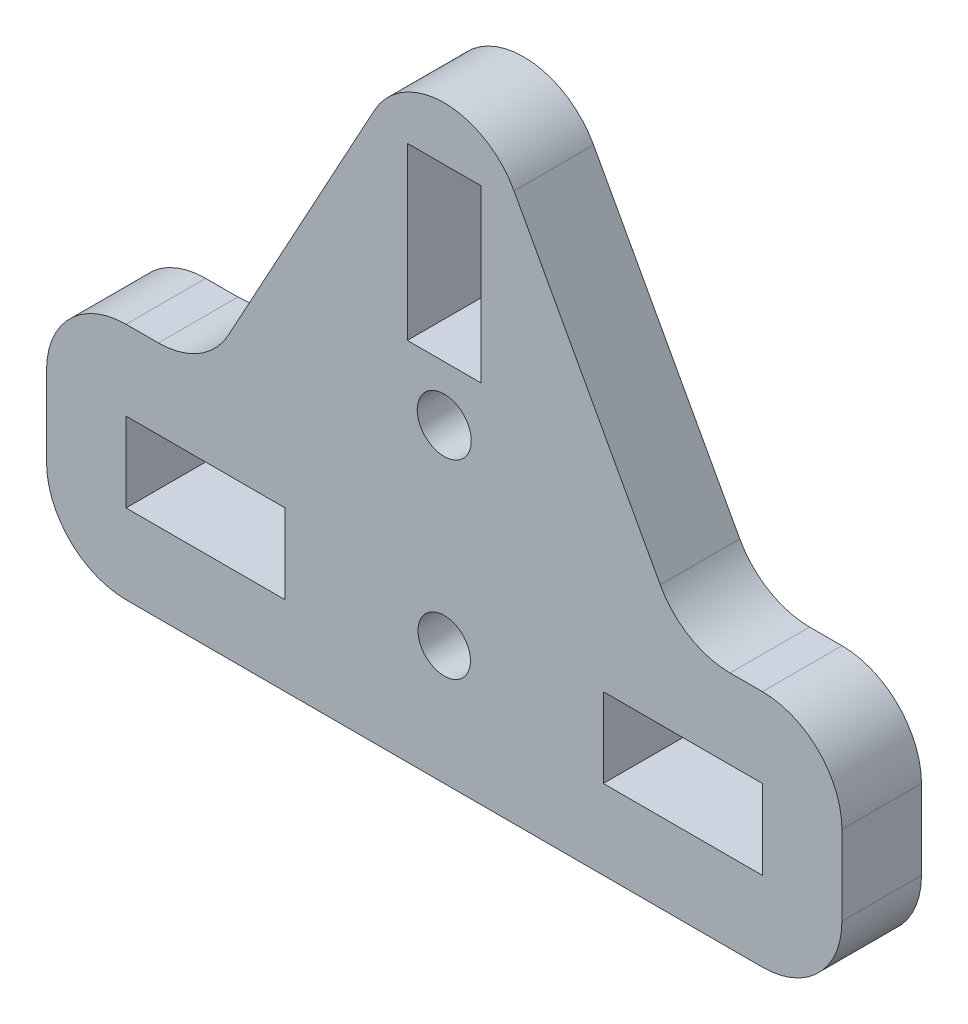
ISO-10303-21;
HEADER;
FILE_DESCRIPTION(('STEP AP214'),'2;1');
FILE_NAME('part.step','',(''),(''),'','','');
FILE_SCHEMA(('AUTOMOTIVE_DESIGN { 1 0 10303 214 1 1 1 1 }'));
ENDSEC;
DATA;
#1=APPLICATION_CONTEXT('core data for automotive mechanical design processes');
#2=APPLICATION_PROTOCOL_DEFINITION('international standard','automotive_design',2000,#1);
#3=PRODUCT_CONTEXT('',#1,'mechanical');
#4=PRODUCT('Part','Part','',(#3));
#5=PRODUCT_RELATED_PRODUCT_CATEGORY('part','',(#4));
#6=PRODUCT_DEFINITION_FORMATION('','',#4);
#7=PRODUCT_DEFINITION_CONTEXT('part definition',#1,'design');
#8=PRODUCT_DEFINITION('design','',#6,#7);
#9=PRODUCT_DEFINITION_SHAPE('','',#8);
#10=(LENGTH_UNIT() NAMED_UNIT(*) SI_UNIT(.MILLI.,.METRE.));
#11=(NAMED_UNIT(*) PLANE_ANGLE_UNIT() SI_UNIT($,.RADIAN.));
#12=(NAMED_UNIT(*) SI_UNIT($,.STERADIAN.) SOLID_ANGLE_UNIT());
#13=UNCERTAINTY_MEASURE_WITH_UNIT(LENGTH_MEASURE(1.E-05),#10,'distance_accuracy_value','');
#14=(GEOMETRIC_REPRESENTATION_CONTEXT(3) GLOBAL_UNCERTAINTY_ASSIGNED_CONTEXT((#13)) GLOBAL_UNIT_ASSIGNED_CONTEXT((#10,
#11,#12)) REPRESENTATION_CONTEXT('',''));
#15=CARTESIAN_POINT('',(0.,0.,0.));
#16=DIRECTION('',(0.,0.,1.));
#17=DIRECTION('',(1.,0.,0.));
#18=AXIS2_PLACEMENT_3D('',#15,#16,#17);
#19=CARTESIAN_POINT('',(-31.75,9.525,6.35));
#20=DIRECTION('',(0.,-1.,0.));
#21=DIRECTION('',(0.,0.,-1.));
#22=AXIS2_PLACEMENT_3D('',#19,#20,#21);
#23=PLANE('',#22);
#24=DIRECTION('',(-1.,0.,0.));
#25=VECTOR('',#24,1.);
#26=CARTESIAN_POINT('',(-31.75,9.525,0.));
#27=LINE('',#26,#25);
#28=CARTESIAN_POINT('',(-22.819570177,9.525,0.));
#29=VERTEX_POINT('',#28);
#30=CARTESIAN_POINT('',(-25.4,9.525,0.));
#31=VERTEX_POINT('',#30);
#32=EDGE_CURVE('E375',#29,#31,#27,.T.);
#33=ORIENTED_EDGE('',*,*,#32,.T.);
#34=DIRECTION('',(0.,0.,-1.));
#35=VECTOR('',#34,1.);
#36=CARTESIAN_POINT('',(-25.4,9.525,6.35));
#37=LINE('',#36,#35);
#38=CARTESIAN_POINT('',(-25.4,9.525,6.35));
#39=VERTEX_POINT('',#38);
#40=EDGE_CURVE('E425',#31,#39,#37,.F.);
#41=ORIENTED_EDGE('',*,*,#40,.T.);
#42=DIRECTION('',(-1.,0.,0.));
#43=VECTOR('',#42,1.);
#44=CARTESIAN_POINT('',(-31.75,9.525,6.35));
#45=LINE('',#44,#43);
#46=CARTESIAN_POINT('',(-22.819570177,9.525,6.35));
#47=VERTEX_POINT('',#46);
#48=EDGE_CURVE('E346',#47,#39,#45,.T.);
#49=ORIENTED_EDGE('',*,*,#48,.F.);
#50=DIRECTION('',(0.,0.,1.));
#51=VECTOR('',#50,1.);
#52=CARTESIAN_POINT('',(-22.819570177,9.525,0.));
#53=LINE('',#52,#51);
#54=EDGE_CURVE('E423',#47,#29,#53,.F.);
#55=ORIENTED_EDGE('',*,*,#54,.T.);
#56=EDGE_LOOP('',(#33,#41,#49,#55));
#57=FACE_BOUND('',#56,.T.);
#58=ADVANCED_FACE('F34',(#57),#23,.F.);
#59=CARTESIAN_POINT('',(31.75,-9.525,6.35));
#60=DIRECTION('',(-1.,0.,0.));
#61=DIRECTION('',(0.,0.,1.));
#62=AXIS2_PLACEMENT_3D('',#59,#60,#61);
#63=PLANE('',#62);
#64=DIRECTION('',(0.,1.,0.));
#65=VECTOR('',#64,1.);
#66=CARTESIAN_POINT('',(31.75,-9.525,6.35));
#67=LINE('',#66,#65);
#68=CARTESIAN_POINT('',(31.75,-3.175,6.35));
#69=VERTEX_POINT('',#68);
#70=CARTESIAN_POINT('',(31.75,3.175,6.35));
#71=VERTEX_POINT('',#70);
#72=EDGE_CURVE('E343',#69,#71,#67,.T.);
#73=ORIENTED_EDGE('',*,*,#72,.F.);
#74=DIRECTION('',(0.,0.,-1.));
#75=VECTOR('',#74,1.);
#76=CARTESIAN_POINT('',(31.75,-3.175,6.35));
#77=LINE('',#76,#75);
#78=CARTESIAN_POINT('',(31.75,-3.175,0.));
#79=VERTEX_POINT('',#78);
#80=EDGE_CURVE('E370',#69,#79,#77,.T.);
#81=ORIENTED_EDGE('',*,*,#80,.T.);
#82=DIRECTION('',(0.,1.,0.));
#83=VECTOR('',#82,1.);
#84=CARTESIAN_POINT('',(31.75,-9.525,0.));
#85=LINE('',#84,#83);
#86=CARTESIAN_POINT('',(31.75,3.175,0.));
#87=VERTEX_POINT('',#86);
#88=EDGE_CURVE('E340',#79,#87,#85,.T.);
#89=ORIENTED_EDGE('',*,*,#88,.T.);
#90=DIRECTION('',(0.,0.,-1.));
#91=VECTOR('',#90,1.);
#92=CARTESIAN_POINT('',(31.75,3.175,6.35));
#93=LINE('',#92,#91);
#94=EDGE_CURVE('E368',#87,#71,#93,.F.);
#95=ORIENTED_EDGE('',*,*,#94,.T.);
#96=EDGE_LOOP('',(#73,#81,#89,#95));
#97=FACE_BOUND('',#96,.T.);
#98=ADVANCED_FACE('F476',(#97),#63,.F.);
#99=CARTESIAN_POINT('',(25.4,9.525,6.35));
#100=VERTEX_POINT('',#99);
#101=CARTESIAN_POINT('',(22.819570177,9.525,6.35));
#102=VERTEX_POINT('',#101);
#103=EDGE_CURVE('E357',#100,#102,#45,.T.);
#104=ORIENTED_EDGE('',*,*,#103,.F.);
#105=DIRECTION('',(0.,0.,-1.));
#106=VECTOR('',#105,1.);
#107=CARTESIAN_POINT('',(25.4,9.525,6.35));
#108=LINE('',#107,#106);
#109=CARTESIAN_POINT('',(25.4,9.525,0.));
#110=VERTEX_POINT('',#109);
#111=EDGE_CURVE('E414',#100,#110,#108,.T.);
#112=ORIENTED_EDGE('',*,*,#111,.T.);
#113=CARTESIAN_POINT('',(22.819570177,9.525,0.));
#114=VERTEX_POINT('',#113);
#115=EDGE_CURVE('E379',#110,#114,#27,.T.);
#116=ORIENTED_EDGE('',*,*,#115,.T.);
#117=DIRECTION('',(0.,0.,1.));
#118=VECTOR('',#117,1.);
#119=CARTESIAN_POINT('',(22.819570177,9.525,6.35));
#120=LINE('',#119,#118);
#121=EDGE_CURVE('E411',#114,#102,#120,.T.);
#122=ORIENTED_EDGE('',*,*,#121,.T.);
#123=EDGE_LOOP('',(#104,#112,#116,#122));
#124=FACE_BOUND('',#123,.T.);
#125=ADVANCED_FACE('F465',(#124),#23,.F.);
#126=CARTESIAN_POINT('',(-31.75,-9.525,6.35));
#127=DIRECTION('',(1.,0.,0.));
#128=DIRECTION('',(0.,0.,-1.));
#129=AXIS2_PLACEMENT_3D('',#126,#127,#128);
#130=PLANE('',#129);
#131=DIRECTION('',(0.,-1.,0.));
#132=VECTOR('',#131,1.);
#133=CARTESIAN_POINT('',(-31.75,-9.525,0.));
#134=LINE('',#133,#132);
#135=CARTESIAN_POINT('',(-31.75,3.175,0.));
#136=VERTEX_POINT('',#135);
#137=CARTESIAN_POINT('',(-31.75,-3.175,0.));
#138=VERTEX_POINT('',#137);
#139=EDGE_CURVE('E384',#136,#138,#134,.T.);
#140=ORIENTED_EDGE('',*,*,#139,.T.);
#141=DIRECTION('',(0.,0.,-1.));
#142=VECTOR('',#141,1.);
#143=CARTESIAN_POINT('',(-31.75,-3.175,6.35));
#144=LINE('',#143,#142);
#145=CARTESIAN_POINT('',(-31.75,-3.175,6.35));
#146=VERTEX_POINT('',#145);
#147=EDGE_CURVE('E49',#138,#146,#144,.F.);
#148=ORIENTED_EDGE('',*,*,#147,.T.);
#149=DIRECTION('',(0.,-1.,0.));
#150=VECTOR('',#149,1.);
#151=CARTESIAN_POINT('',(-31.75,-9.525,6.35));
#152=LINE('',#151,#150);
#153=CARTESIAN_POINT('',(-31.75,3.175,6.35));
#154=VERTEX_POINT('',#153);
#155=EDGE_CURVE('E350',#154,#146,#152,.T.);
#156=ORIENTED_EDGE('',*,*,#155,.F.);
#157=DIRECTION('',(0.,0.,-1.));
#158=VECTOR('',#157,1.);
#159=CARTESIAN_POINT('',(-31.75,3.175,6.35));
#160=LINE('',#159,#158);
#161=EDGE_CURVE('E419',#154,#136,#160,.T.);
#162=ORIENTED_EDGE('',*,*,#161,.T.);
#163=EDGE_LOOP('',(#140,#148,#156,#162));
#164=FACE_BOUND('',#163,.T.);
#165=ADVANCED_FACE('F508',(#164),#130,.F.);
#166=CARTESIAN_POINT('',(-31.75,-9.525,6.35));
#167=DIRECTION('',(0.,1.,0.));
#168=DIRECTION('',(0.,0.,1.));
#169=AXIS2_PLACEMENT_3D('',#166,#167,#168);
#170=PLANE('',#169);
#171=DIRECTION('',(1.,0.,0.));
#172=VECTOR('',#171,1.);
#173=CARTESIAN_POINT('',(-31.75,-9.525,0.));
#174=LINE('',#173,#172);
#175=CARTESIAN_POINT('',(-25.4,-9.525,0.));
#176=VERTEX_POINT('',#175);
#177=CARTESIAN_POINT('',(25.4,-9.525,0.));
#178=VERTEX_POINT('',#177);
#179=EDGE_CURVE('E347',#176,#178,#174,.T.);
#180=ORIENTED_EDGE('',*,*,#179,.T.);
#181=DIRECTION('',(0.,0.,-1.));
#182=VECTOR('',#181,1.);
#183=CARTESIAN_POINT('',(25.4,-9.525,6.35));
#184=LINE('',#183,#182);
#185=CARTESIAN_POINT('',(25.4,-9.525,6.35));
#186=VERTEX_POINT('',#185);
#187=EDGE_CURVE('E360',#178,#186,#184,.F.);
#188=ORIENTED_EDGE('',*,*,#187,.T.);
#189=DIRECTION('',(1.,0.,0.));
#190=VECTOR('',#189,1.);
#191=CARTESIAN_POINT('',(-31.75,-9.525,6.35));
#192=LINE('',#191,#190);
#193=CARTESIAN_POINT('',(-25.4,-9.525,6.35));
#194=VERTEX_POINT('',#193);
#195=EDGE_CURVE('E371',#194,#186,#192,.T.);
#196=ORIENTED_EDGE('',*,*,#195,.F.);
#197=DIRECTION('',(0.,0.,-1.));
#198=VECTOR('',#197,1.);
#199=CARTESIAN_POINT('',(-25.4,-9.525,6.35));
#200=LINE('',#199,#198);
#201=EDGE_CURVE('E395',#194,#176,#200,.T.);
#202=ORIENTED_EDGE('',*,*,#201,.T.);
#203=EDGE_LOOP('',(#180,#188,#196,#202));
#204=FACE_BOUND('',#203,.T.);
#205=ADVANCED_FACE('F481',(#204),#170,.F.);
#206=CARTESIAN_POINT('',(0.,0.,6.35));
#207=DIRECTION('',(0.,0.,-1.));
#208=DIRECTION('',(-1.,0.,0.));
#209=AXIS2_PLACEMENT_3D('',#206,#207,#208);
#210=PLANE('',#209);
#211=DIRECTION('',(1.,0.,0.));
#212=VECTOR('',#211,1.);
#213=CARTESIAN_POINT('',(-2.94640000000003,33.2635268836412,6.35));
#214=LINE('',#213,#212);
#215=CARTESIAN_POINT('',(-2.94640000000003,33.2635268836412,6.35));
#216=VERTEX_POINT('',#215);
#217=CARTESIAN_POINT('',(2.94639999999998,33.2635268836412,6.35));
#218=VERTEX_POINT('',#217);
#219=EDGE_CURVE('E220',#216,#218,#214,.T.);
#220=ORIENTED_EDGE('',*,*,#219,.T.);
#221=DIRECTION('',(0.,-1.,0.));
#222=VECTOR('',#221,1.);
#223=CARTESIAN_POINT('',(2.94639999999998,33.2635268836412,6.35));
#224=LINE('',#223,#222);
#225=CARTESIAN_POINT('',(2.94639999999999,19.6364268836412,6.35));
#226=VERTEX_POINT('',#225);
#227=EDGE_CURVE('E212',#218,#226,#224,.T.);
#228=ORIENTED_EDGE('',*,*,#227,.T.);
#229=DIRECTION('',(-1.,0.,0.));
#230=VECTOR('',#229,1.);
#231=CARTESIAN_POINT('',(2.94639999999999,19.6364268836412,6.35));
#232=LINE('',#231,#230);
#233=CARTESIAN_POINT('',(-2.94640000000002,19.6364268836412,6.35));
#234=VERTEX_POINT('',#233);
#235=EDGE_CURVE('E224',#226,#234,#232,.T.);
#236=ORIENTED_EDGE('',*,*,#235,.T.);
#237=DIRECTION('',(0.,1.,0.));
#238=VECTOR('',#237,1.);
#239=CARTESIAN_POINT('',(-2.94640000000002,19.6364268836412,6.35));
#240=LINE('',#239,#238);
#241=EDGE_CURVE('E228',#234,#216,#240,.T.);
#242=ORIENTED_EDGE('',*,*,#241,.T.);
#243=EDGE_LOOP('',(#220,#228,#236,#242));
#244=FACE_BOUND('',#243,.T.);
#245=CARTESIAN_POINT('',(0.,15.2399999999999,6.35));
#246=DIRECTION('',(0.,0.,-1.));
#247=DIRECTION('',(-1.,0.,0.));
#248=AXIS2_PLACEMENT_3D('',#245,#246,#247);
#249=CIRCLE('',#248,2.159);
#250=CARTESIAN_POINT('',(-2.15900000000001,15.2399999999999,6.35));
#251=VERTEX_POINT('',#250);
#252=EDGE_CURVE('E252',#251,#251,#249,.T.);
#253=ORIENTED_EDGE('',*,*,#252,.T.);
#254=EDGE_LOOP('',(#253));
#255=FACE_BOUND('',#254,.T.);
#256=DIRECTION('',(1.,0.,0.));
#257=VECTOR('',#256,1.);
#258=CARTESIAN_POINT('',(12.7,-3.175,6.35));
#259=LINE('',#258,#257);
#260=CARTESIAN_POINT('',(12.7,-3.175,6.35));
#261=VERTEX_POINT('',#260);
#262=CARTESIAN_POINT('',(25.4,-3.175,6.35));
#263=VERTEX_POINT('',#262);
#264=EDGE_CURVE('E288',#261,#263,#259,.T.);
#265=ORIENTED_EDGE('',*,*,#264,.F.);
#266=DIRECTION('',(0.,-1.,0.));
#267=VECTOR('',#266,1.);
#268=CARTESIAN_POINT('',(12.7,3.175,6.35));
#269=LINE('',#268,#267);
#270=CARTESIAN_POINT('',(12.7,3.175,6.35));
#271=VERTEX_POINT('',#270);
#272=EDGE_CURVE('E270',#271,#261,#269,.T.);
#273=ORIENTED_EDGE('',*,*,#272,.F.);
#274=DIRECTION('',(-1.,0.,0.));
#275=VECTOR('',#274,1.);
#276=CARTESIAN_POINT('',(12.7,3.175,6.35));
#277=LINE('',#276,#275);
#278=CARTESIAN_POINT('',(25.4,3.175,6.35));
#279=VERTEX_POINT('',#278);
#280=EDGE_CURVE('E277',#279,#271,#277,.T.);
#281=ORIENTED_EDGE('',*,*,#280,.F.);
#282=DIRECTION('',(0.,1.,0.));
#283=VECTOR('',#282,1.);
#284=CARTESIAN_POINT('',(25.4,3.175,6.35));
#285=LINE('',#284,#283);
#286=EDGE_CURVE('E291',#263,#279,#285,.T.);
#287=ORIENTED_EDGE('',*,*,#286,.F.);
#288=EDGE_LOOP('',(#265,#273,#281,#287));
#289=FACE_BOUND('',#288,.T.);
#290=DIRECTION('',(1.,0.,0.));
#291=VECTOR('',#290,1.);
#292=CARTESIAN_POINT('',(-25.4,-3.175,6.35));
#293=LINE('',#292,#291);
#294=CARTESIAN_POINT('',(-25.4,-3.175,6.35));
#295=VERTEX_POINT('',#294);
#296=CARTESIAN_POINT('',(-12.7,-3.175,6.35));
#297=VERTEX_POINT('',#296);
#298=EDGE_CURVE('E320',#295,#297,#293,.T.);
#299=ORIENTED_EDGE('',*,*,#298,.F.);
#300=DIRECTION('',(0.,-1.,0.));
#301=VECTOR('',#300,1.);
#302=CARTESIAN_POINT('',(-25.4,3.175,6.35));
#303=LINE('',#302,#301);
#304=CARTESIAN_POINT('',(-25.4,3.175,6.35));
#305=VERTEX_POINT('',#304);
#306=EDGE_CURVE('E298',#305,#295,#303,.T.);
#307=ORIENTED_EDGE('',*,*,#306,.F.);
#308=DIRECTION('',(-1.,0.,0.));
#309=VECTOR('',#308,1.);
#310=CARTESIAN_POINT('',(-25.4,3.175,6.35));
#311=LINE('',#310,#309);
#312=CARTESIAN_POINT('',(-12.7,3.175,6.35));
#313=VERTEX_POINT('',#312);
#314=EDGE_CURVE('E309',#313,#305,#311,.T.);
#315=ORIENTED_EDGE('',*,*,#314,.F.);
#316=DIRECTION('',(0.,1.,0.));
#317=VECTOR('',#316,1.);
#318=CARTESIAN_POINT('',(-12.7,3.175,6.35));
#319=LINE('',#318,#317);
#320=EDGE_CURVE('E323',#297,#313,#319,.T.);
#321=ORIENTED_EDGE('',*,*,#320,.F.);
#322=EDGE_LOOP('',(#299,#307,#315,#321));
#323=FACE_BOUND('',#322,.T.);
#324=CARTESIAN_POINT('',(0.,0.,6.35));
#325=DIRECTION('',(0.,0.,1.));
#326=DIRECTION('',(1.,0.,0.));
#327=AXIS2_PLACEMENT_3D('',#324,#325,#326);
#328=CIRCLE('',#327,2.0955);
#329=CARTESIAN_POINT('',(2.09550000000001,0.,6.35));
#330=VERTEX_POINT('',#329);
#331=EDGE_CURVE('E330',#330,#330,#328,.T.);
#332=ORIENTED_EDGE('',*,*,#331,.F.);
#333=EDGE_LOOP('',(#332));
#334=FACE_BOUND('',#333,.T.);
#335=ORIENTED_EDGE('',*,*,#195,.T.);
#336=CARTESIAN_POINT('',(25.4,-3.175,6.35));
#337=DIRECTION('',(0.,0.,-1.));
#338=DIRECTION('',(-1.,0.,0.));
#339=AXIS2_PLACEMENT_3D('',#336,#337,#338);
#340=CIRCLE('',#339,6.35);
#341=EDGE_CURVE('E409',#186,#69,#340,.F.);
#342=ORIENTED_EDGE('',*,*,#341,.T.);
#343=ORIENTED_EDGE('',*,*,#72,.T.);
#344=CARTESIAN_POINT('',(25.4,3.175,6.35));
#345=DIRECTION('',(0.,0.,-1.));
#346=DIRECTION('',(-1.,0.,0.));
#347=AXIS2_PLACEMENT_3D('',#344,#345,#346);
#348=CIRCLE('',#347,6.35);
#349=EDGE_CURVE('E405',#71,#100,#348,.F.);
#350=ORIENTED_EDGE('',*,*,#349,.T.);
#351=ORIENTED_EDGE('',*,*,#103,.T.);
#352=CARTESIAN_POINT('',(22.819570177,15.875,6.35));
#353=DIRECTION('',(0.,0.,-1.));
#354=DIRECTION('',(-1.,0.,0.));
#355=AXIS2_PLACEMENT_3D('',#352,#353,#354);
#356=CIRCLE('',#355,6.35);
#357=CARTESIAN_POINT('',(17.2449332889936,12.8342889701784,6.35));
#358=VERTEX_POINT('',#357);
#359=EDGE_CURVE('E430',#102,#358,#356,.T.);
#360=ORIENTED_EDGE('',*,*,#359,.T.);
#361=DIRECTION('',(0.478852130680573,-0.877895572914384,0.));
#362=VECTOR('',#361,1.);
#363=CARTESIAN_POINT('',(18.6859872611465,10.1923566878981,6.35));
#364=LINE('',#363,#362);
#365=CARTESIAN_POINT('',(5.57463688800634,34.2298323719884,6.35));
#366=VERTEX_POINT('',#365);
#367=EDGE_CURVE('E255',#366,#358,#364,.T.);
#368=ORIENTED_EDGE('',*,*,#367,.F.);
#369=CARTESIAN_POINT('',(0.,31.1891213421667,6.35));
#370=DIRECTION('',(0.,0.,1.));
#371=DIRECTION('',(1.,0.,0.));
#372=AXIS2_PLACEMENT_3D('',#369,#370,#371);
#373=CIRCLE('',#372,6.35);
#374=CARTESIAN_POINT('',(-5.57463688800634,34.2298323719884,6.35));
#375=VERTEX_POINT('',#374);
#376=EDGE_CURVE('E263',#366,#375,#373,.T.);
#377=ORIENTED_EDGE('',*,*,#376,.T.);
#378=DIRECTION('',(0.478852130680573,0.877895572914384,0.));
#379=VECTOR('',#378,1.);
#380=CARTESIAN_POINT('',(-18.6859872611465,10.1923566878981,6.35));
#381=LINE('',#380,#379);
#382=CARTESIAN_POINT('',(-17.2449332889936,12.8342889701784,6.35));
#383=VERTEX_POINT('',#382);
#384=EDGE_CURVE('E266',#383,#375,#381,.T.);
#385=ORIENTED_EDGE('',*,*,#384,.F.);
#386=CARTESIAN_POINT('',(-22.819570177,15.875,6.35));
#387=DIRECTION('',(0.,0.,-1.));
#388=DIRECTION('',(-1.,0.,0.));
#389=AXIS2_PLACEMENT_3D('',#386,#387,#388);
#390=CIRCLE('',#389,6.35);
#391=EDGE_CURVE('E42',#383,#47,#390,.T.);
#392=ORIENTED_EDGE('',*,*,#391,.T.);
#393=ORIENTED_EDGE('',*,*,#48,.T.);
#394=CARTESIAN_POINT('',(-25.4,3.175,6.35));
#395=DIRECTION('',(0.,0.,-1.));
#396=DIRECTION('',(-1.,0.,0.));
#397=AXIS2_PLACEMENT_3D('',#394,#395,#396);
#398=CIRCLE('',#397,6.35);
#399=EDGE_CURVE('E56',#39,#154,#398,.F.);
#400=ORIENTED_EDGE('',*,*,#399,.T.);
#401=ORIENTED_EDGE('',*,*,#155,.T.);
#402=CARTESIAN_POINT('',(-25.4,-3.175,6.35));
#403=DIRECTION('',(0.,0.,-1.));
#404=DIRECTION('',(-1.,0.,0.));
#405=AXIS2_PLACEMENT_3D('',#402,#403,#404);
#406=CIRCLE('',#405,6.35);
#407=EDGE_CURVE('E404',#146,#194,#406,.F.);
#408=ORIENTED_EDGE('',*,*,#407,.T.);
#409=EDGE_LOOP('',(#335,#342,#343,#350,#351,#360,#368,#377,#385,#392,#393,#400,#401,#408));
#410=FACE_BOUND('',#409,.T.);
#411=ADVANCED_FACE('F230',(#244,#255,#289,#323,#334,#410),#210,.F.);
#412=CARTESIAN_POINT('',(0.,0.,0.));
#413=DIRECTION('',(0.,0.,-1.));
#414=DIRECTION('',(-1.,0.,0.));
#415=AXIS2_PLACEMENT_3D('',#412,#413,#414);
#416=PLANE('',#415);
#417=DIRECTION('',(0.,-1.,0.));
#418=VECTOR('',#417,1.);
#419=CARTESIAN_POINT('',(2.94639999999998,33.2635268836412,0.));
#420=LINE('',#419,#418);
#421=CARTESIAN_POINT('',(2.94639999999998,33.2635268836412,0.));
#422=VERTEX_POINT('',#421);
#423=CARTESIAN_POINT('',(2.94639999999999,19.6364268836412,0.));
#424=VERTEX_POINT('',#423);
#425=EDGE_CURVE('E215',#422,#424,#420,.T.);
#426=ORIENTED_EDGE('',*,*,#425,.F.);
#427=DIRECTION('',(1.,0.,0.));
#428=VECTOR('',#427,1.);
#429=CARTESIAN_POINT('',(-2.94640000000003,33.2635268836412,0.));
#430=LINE('',#429,#428);
#431=CARTESIAN_POINT('',(-2.94640000000003,33.2635268836412,0.));
#432=VERTEX_POINT('',#431);
#433=EDGE_CURVE('E233',#432,#422,#430,.T.);
#434=ORIENTED_EDGE('',*,*,#433,.F.);
#435=DIRECTION('',(0.,1.,0.));
#436=VECTOR('',#435,1.);
#437=CARTESIAN_POINT('',(-2.94640000000002,19.6364268836412,0.));
#438=LINE('',#437,#436);
#439=CARTESIAN_POINT('',(-2.94640000000002,19.6364268836412,0.));
#440=VERTEX_POINT('',#439);
#441=EDGE_CURVE('E236',#440,#432,#438,.T.);
#442=ORIENTED_EDGE('',*,*,#441,.F.);
#443=DIRECTION('',(-1.,0.,0.));
#444=VECTOR('',#443,1.);
#445=CARTESIAN_POINT('',(2.94639999999999,19.6364268836412,0.));
#446=LINE('',#445,#444);
#447=EDGE_CURVE('E242',#424,#440,#446,.T.);
#448=ORIENTED_EDGE('',*,*,#447,.F.);
#449=EDGE_LOOP('',(#426,#434,#442,#448));
#450=FACE_BOUND('',#449,.T.);
#451=CARTESIAN_POINT('',(0.,15.2399999999999,0.));
#452=DIRECTION('',(0.,0.,-1.));
#453=DIRECTION('',(-1.,0.,0.));
#454=AXIS2_PLACEMENT_3D('',#451,#452,#453);
#455=CIRCLE('',#454,2.159);
#456=CARTESIAN_POINT('',(-2.15900000000001,15.2399999999999,0.));
#457=VERTEX_POINT('',#456);
#458=EDGE_CURVE('E248',#457,#457,#455,.T.);
#459=ORIENTED_EDGE('',*,*,#458,.F.);
#460=EDGE_LOOP('',(#459));
#461=FACE_BOUND('',#460,.T.);
#462=DIRECTION('',(0.,-1.,0.));
#463=VECTOR('',#462,1.);
#464=CARTESIAN_POINT('',(12.7,3.175,0.));
#465=LINE('',#464,#463);
#466=CARTESIAN_POINT('',(12.7,3.175,0.));
#467=VERTEX_POINT('',#466);
#468=CARTESIAN_POINT('',(12.7,-3.175,0.));
#469=VERTEX_POINT('',#468);
#470=EDGE_CURVE('E273',#467,#469,#465,.T.);
#471=ORIENTED_EDGE('',*,*,#470,.T.);
#472=DIRECTION('',(1.,0.,0.));
#473=VECTOR('',#472,1.);
#474=CARTESIAN_POINT('',(12.7,-3.175,0.));
#475=LINE('',#474,#473);
#476=CARTESIAN_POINT('',(25.4,-3.175,0.));
#477=VERTEX_POINT('',#476);
#478=EDGE_CURVE('E276',#469,#477,#475,.T.);
#479=ORIENTED_EDGE('',*,*,#478,.T.);
#480=DIRECTION('',(0.,1.,0.));
#481=VECTOR('',#480,1.);
#482=CARTESIAN_POINT('',(25.4,3.175,0.));
#483=LINE('',#482,#481);
#484=CARTESIAN_POINT('',(25.4,3.175,0.));
#485=VERTEX_POINT('',#484);
#486=EDGE_CURVE('E280',#477,#485,#483,.T.);
#487=ORIENTED_EDGE('',*,*,#486,.T.);
#488=DIRECTION('',(-1.,0.,0.));
#489=VECTOR('',#488,1.);
#490=CARTESIAN_POINT('',(12.7,3.175,0.));
#491=LINE('',#490,#489);
#492=EDGE_CURVE('E283',#485,#467,#491,.T.);
#493=ORIENTED_EDGE('',*,*,#492,.T.);
#494=EDGE_LOOP('',(#471,#479,#487,#493));
#495=FACE_BOUND('',#494,.T.);
#496=DIRECTION('',(0.,-1.,0.));
#497=VECTOR('',#496,1.);
#498=CARTESIAN_POINT('',(-25.4,3.175,0.));
#499=LINE('',#498,#497);
#500=CARTESIAN_POINT('',(-25.4,3.175,0.));
#501=VERTEX_POINT('',#500);
#502=CARTESIAN_POINT('',(-25.4,-3.175,0.));
#503=VERTEX_POINT('',#502);
#504=EDGE_CURVE('E305',#501,#503,#499,.T.);
#505=ORIENTED_EDGE('',*,*,#504,.T.);
#506=DIRECTION('',(1.,0.,0.));
#507=VECTOR('',#506,1.);
#508=CARTESIAN_POINT('',(-25.4,-3.175,0.));
#509=LINE('',#508,#507);
#510=CARTESIAN_POINT('',(-12.7,-3.175,0.));
#511=VERTEX_POINT('',#510);
#512=EDGE_CURVE('E308',#503,#511,#509,.T.);
#513=ORIENTED_EDGE('',*,*,#512,.T.);
#514=DIRECTION('',(0.,1.,0.));
#515=VECTOR('',#514,1.);
#516=CARTESIAN_POINT('',(-12.7,3.175,0.));
#517=LINE('',#516,#515);
#518=CARTESIAN_POINT('',(-12.7,3.175,0.));
#519=VERTEX_POINT('',#518);
#520=EDGE_CURVE('E312',#511,#519,#517,.T.);
#521=ORIENTED_EDGE('',*,*,#520,.T.);
#522=DIRECTION('',(-1.,0.,0.));
#523=VECTOR('',#522,1.);
#524=CARTESIAN_POINT('',(-25.4,3.175,0.));
#525=LINE('',#524,#523);
#526=EDGE_CURVE('E315',#519,#501,#525,.T.);
#527=ORIENTED_EDGE('',*,*,#526,.T.);
#528=EDGE_LOOP('',(#505,#513,#521,#527));
#529=FACE_BOUND('',#528,.T.);
#530=CARTESIAN_POINT('',(0.,0.,0.));
#531=DIRECTION('',(0.,0.,1.));
#532=DIRECTION('',(1.,0.,0.));
#533=AXIS2_PLACEMENT_3D('',#530,#531,#532);
#534=CIRCLE('',#533,2.0955);
#535=CARTESIAN_POINT('',(2.09550000000001,0.,0.));
#536=VERTEX_POINT('',#535);
#537=EDGE_CURVE('E337',#536,#536,#534,.T.);
#538=ORIENTED_EDGE('',*,*,#537,.T.);
#539=EDGE_LOOP('',(#538));
#540=FACE_BOUND('',#539,.T.);
#541=ORIENTED_EDGE('',*,*,#88,.F.);
#542=CARTESIAN_POINT('',(25.4,-3.175,0.));
#543=DIRECTION('',(0.,0.,-1.));
#544=DIRECTION('',(-1.,0.,0.));
#545=AXIS2_PLACEMENT_3D('',#542,#543,#544);
#546=CIRCLE('',#545,6.35);
#547=EDGE_CURVE('E394',#79,#178,#546,.T.);
#548=ORIENTED_EDGE('',*,*,#547,.T.);
#549=ORIENTED_EDGE('',*,*,#179,.F.);
#550=CARTESIAN_POINT('',(-25.4,-3.175,0.));
#551=DIRECTION('',(0.,0.,-1.));
#552=DIRECTION('',(-1.,0.,0.));
#553=AXIS2_PLACEMENT_3D('',#550,#551,#552);
#554=CIRCLE('',#553,6.35);
#555=EDGE_CURVE('E390',#176,#138,#554,.T.);
#556=ORIENTED_EDGE('',*,*,#555,.T.);
#557=ORIENTED_EDGE('',*,*,#139,.F.);
#558=CARTESIAN_POINT('',(-25.4,3.175,0.));
#559=DIRECTION('',(0.,0.,-1.));
#560=DIRECTION('',(-1.,0.,0.));
#561=AXIS2_PLACEMENT_3D('',#558,#559,#560);
#562=CIRCLE('',#561,6.35);
#563=EDGE_CURVE('E374',#136,#31,#562,.T.);
#564=ORIENTED_EDGE('',*,*,#563,.T.);
#565=ORIENTED_EDGE('',*,*,#32,.F.);
#566=CARTESIAN_POINT('',(-22.819570177,15.875,0.));
#567=DIRECTION('',(0.,0.,-1.));
#568=DIRECTION('',(-1.,0.,0.));
#569=AXIS2_PLACEMENT_3D('',#566,#567,#568);
#570=CIRCLE('',#569,6.35);
#571=CARTESIAN_POINT('',(-17.2449332889936,12.8342889701784,0.));
#572=VERTEX_POINT('',#571);
#573=EDGE_CURVE('E11',#29,#572,#570,.F.);
#574=ORIENTED_EDGE('',*,*,#573,.T.);
#575=DIRECTION('',(0.478852130680573,0.877895572914384,0.));
#576=VECTOR('',#575,1.);
#577=CARTESIAN_POINT('',(-18.6859872611465,10.1923566878981,0.));
#578=LINE('',#577,#576);
#579=CARTESIAN_POINT('',(-5.57463688800634,34.2298323719884,0.));
#580=VERTEX_POINT('',#579);
#581=EDGE_CURVE('E261',#572,#580,#578,.T.);
#582=ORIENTED_EDGE('',*,*,#581,.T.);
#583=CARTESIAN_POINT('',(0.,31.1891213421667,0.));
#584=DIRECTION('',(0.,0.,1.));
#585=DIRECTION('',(1.,0.,0.));
#586=AXIS2_PLACEMENT_3D('',#583,#584,#585);
#587=CIRCLE('',#586,6.35);
#588=CARTESIAN_POINT('',(5.57463688800634,34.2298323719884,0.));
#589=VERTEX_POINT('',#588);
#590=EDGE_CURVE('E258',#589,#580,#587,.T.);
#591=ORIENTED_EDGE('',*,*,#590,.F.);
#592=DIRECTION('',(0.478852130680573,-0.877895572914384,0.));
#593=VECTOR('',#592,1.);
#594=CARTESIAN_POINT('',(18.6859872611465,10.1923566878981,0.));
#595=LINE('',#594,#593);
#596=CARTESIAN_POINT('',(17.2449332889936,12.8342889701784,0.));
#597=VERTEX_POINT('',#596);
#598=EDGE_CURVE('E262',#589,#597,#595,.T.);
#599=ORIENTED_EDGE('',*,*,#598,.T.);
#600=CARTESIAN_POINT('',(22.819570177,15.875,0.));
#601=DIRECTION('',(0.,0.,-1.));
#602=DIRECTION('',(-1.,0.,0.));
#603=AXIS2_PLACEMENT_3D('',#600,#601,#602);
#604=CIRCLE('',#603,6.35);
#605=EDGE_CURVE('E432',#597,#114,#604,.F.);
#606=ORIENTED_EDGE('',*,*,#605,.T.);
#607=ORIENTED_EDGE('',*,*,#115,.F.);
#608=CARTESIAN_POINT('',(25.4,3.175,0.));
#609=DIRECTION('',(0.,0.,-1.));
#610=DIRECTION('',(-1.,0.,0.));
#611=AXIS2_PLACEMENT_3D('',#608,#609,#610);
#612=CIRCLE('',#611,6.35);
#613=EDGE_CURVE('E392',#110,#87,#612,.T.);
#614=ORIENTED_EDGE('',*,*,#613,.T.);
#615=EDGE_LOOP('',(#541,#548,#549,#556,#557,#564,#565,#574,#582,#591,#599,#606,#607,#614));
#616=FACE_BOUND('',#615,.T.);
#617=ADVANCED_FACE('F445',(#450,#461,#495,#529,#540,#616),#416,.T.);
#618=CARTESIAN_POINT('',(0.,0.,0.));
#619=DIRECTION('',(0.,0.,1.));
#620=DIRECTION('',(1.,0.,0.));
#621=AXIS2_PLACEMENT_3D('',#618,#619,#620);
#622=CYLINDRICAL_SURFACE('',#621,2.0955);
#623=ORIENTED_EDGE('',*,*,#537,.F.);
#624=EDGE_LOOP('',(#623));
#625=FACE_BOUND('',#624,.T.);
#626=ORIENTED_EDGE('',*,*,#331,.T.);
#627=EDGE_LOOP('',(#626));
#628=FACE_BOUND('',#627,.T.);
#629=ADVANCED_FACE('F519',(#625,#628),#622,.F.);
#630=CARTESIAN_POINT('',(-25.4,3.175,0.));
#631=DIRECTION('',(-1.,0.,0.));
#632=DIRECTION('',(0.,0.,1.));
#633=AXIS2_PLACEMENT_3D('',#630,#631,#632);
#634=PLANE('',#633);
#635=ORIENTED_EDGE('',*,*,#306,.T.);
#636=DIRECTION('',(0.,0.,1.));
#637=VECTOR('',#636,1.);
#638=CARTESIAN_POINT('',(-25.4,-3.175,0.));
#639=LINE('',#638,#637);
#640=EDGE_CURVE('E318',#503,#295,#639,.T.);
#641=ORIENTED_EDGE('',*,*,#640,.F.);
#642=ORIENTED_EDGE('',*,*,#504,.F.);
#643=DIRECTION('',(0.,0.,1.));
#644=VECTOR('',#643,1.);
#645=CARTESIAN_POINT('',(-25.4,3.175,0.));
#646=LINE('',#645,#644);
#647=EDGE_CURVE('E328',#501,#305,#646,.T.);
#648=ORIENTED_EDGE('',*,*,#647,.T.);
#649=EDGE_LOOP('',(#635,#641,#642,#648));
#650=FACE_BOUND('',#649,.T.);
#651=ADVANCED_FACE('F525',(#650),#634,.F.);
#652=CARTESIAN_POINT('',(-25.4,3.175,0.));
#653=DIRECTION('',(0.,1.,0.));
#654=DIRECTION('',(0.,0.,1.));
#655=AXIS2_PLACEMENT_3D('',#652,#653,#654);
#656=PLANE('',#655);
#657=ORIENTED_EDGE('',*,*,#314,.T.);
#658=ORIENTED_EDGE('',*,*,#647,.F.);
#659=ORIENTED_EDGE('',*,*,#526,.F.);
#660=DIRECTION('',(0.,0.,1.));
#661=VECTOR('',#660,1.);
#662=CARTESIAN_POINT('',(-12.7,3.175,0.));
#663=LINE('',#662,#661);
#664=EDGE_CURVE('E331',#519,#313,#663,.T.);
#665=ORIENTED_EDGE('',*,*,#664,.T.);
#666=EDGE_LOOP('',(#657,#658,#659,#665));
#667=FACE_BOUND('',#666,.T.);
#668=ADVANCED_FACE('F529',(#667),#656,.F.);
#669=CARTESIAN_POINT('',(-12.7,3.175,0.));
#670=DIRECTION('',(1.,0.,0.));
#671=DIRECTION('',(0.,1.,0.));
#672=AXIS2_PLACEMENT_3D('',#669,#670,#671);
#673=PLANE('',#672);
#674=ORIENTED_EDGE('',*,*,#320,.T.);
#675=ORIENTED_EDGE('',*,*,#664,.F.);
#676=ORIENTED_EDGE('',*,*,#520,.F.);
#677=DIRECTION('',(0.,0.,1.));
#678=VECTOR('',#677,1.);
#679=CARTESIAN_POINT('',(-12.7,-3.175,0.));
#680=LINE('',#679,#678);
#681=EDGE_CURVE('E333',#511,#297,#680,.T.);
#682=ORIENTED_EDGE('',*,*,#681,.T.);
#683=EDGE_LOOP('',(#674,#675,#676,#682));
#684=FACE_BOUND('',#683,.T.);
#685=ADVANCED_FACE('F535',(#684),#673,.F.);
#686=CARTESIAN_POINT('',(-25.4,-3.175,0.));
#687=DIRECTION('',(0.,-1.,0.));
#688=DIRECTION('',(0.,0.,-1.));
#689=AXIS2_PLACEMENT_3D('',#686,#687,#688);
#690=PLANE('',#689);
#691=ORIENTED_EDGE('',*,*,#298,.T.);
#692=ORIENTED_EDGE('',*,*,#681,.F.);
#693=ORIENTED_EDGE('',*,*,#512,.F.);
#694=ORIENTED_EDGE('',*,*,#640,.T.);
#695=EDGE_LOOP('',(#691,#692,#693,#694));
#696=FACE_BOUND('',#695,.T.);
#697=ADVANCED_FACE('F531',(#696),#690,.F.);
#698=CARTESIAN_POINT('',(12.7,3.175,0.));
#699=DIRECTION('',(-1.,0.,0.));
#700=DIRECTION('',(0.,-1.,0.));
#701=AXIS2_PLACEMENT_3D('',#698,#699,#700);
#702=PLANE('',#701);
#703=ORIENTED_EDGE('',*,*,#272,.T.);
#704=DIRECTION('',(0.,0.,1.));
#705=VECTOR('',#704,1.);
#706=CARTESIAN_POINT('',(12.7,-3.175,0.));
#707=LINE('',#706,#705);
#708=EDGE_CURVE('E286',#469,#261,#707,.T.);
#709=ORIENTED_EDGE('',*,*,#708,.F.);
#710=ORIENTED_EDGE('',*,*,#470,.F.);
#711=DIRECTION('',(0.,0.,1.));
#712=VECTOR('',#711,1.);
#713=CARTESIAN_POINT('',(12.7,3.175,0.));
#714=LINE('',#713,#712);
#715=EDGE_CURVE('E296',#467,#271,#714,.T.);
#716=ORIENTED_EDGE('',*,*,#715,.T.);
#717=EDGE_LOOP('',(#703,#709,#710,#716));
#718=FACE_BOUND('',#717,.T.);
#719=ADVANCED_FACE('F534',(#718),#702,.F.);
#720=CARTESIAN_POINT('',(12.7,3.175,0.));
#721=DIRECTION('',(0.,1.,0.));
#722=DIRECTION('',(0.,0.,1.));
#723=AXIS2_PLACEMENT_3D('',#720,#721,#722);
#724=PLANE('',#723);
#725=ORIENTED_EDGE('',*,*,#280,.T.);
#726=ORIENTED_EDGE('',*,*,#715,.F.);
#727=ORIENTED_EDGE('',*,*,#492,.F.);
#728=DIRECTION('',(0.,0.,1.));
#729=VECTOR('',#728,1.);
#730=CARTESIAN_POINT('',(25.4,3.175,0.));
#731=LINE('',#730,#729);
#732=EDGE_CURVE('E299',#485,#279,#731,.T.);
#733=ORIENTED_EDGE('',*,*,#732,.T.);
#734=EDGE_LOOP('',(#725,#726,#727,#733));
#735=FACE_BOUND('',#734,.T.);
#736=ADVANCED_FACE('F544',(#735),#724,.F.);
#737=CARTESIAN_POINT('',(25.4,3.175,0.));
#738=DIRECTION('',(1.,0.,0.));
#739=DIRECTION('',(0.,1.,0.));
#740=AXIS2_PLACEMENT_3D('',#737,#738,#739);
#741=PLANE('',#740);
#742=ORIENTED_EDGE('',*,*,#286,.T.);
#743=ORIENTED_EDGE('',*,*,#732,.F.);
#744=ORIENTED_EDGE('',*,*,#486,.F.);
#745=DIRECTION('',(0.,0.,1.));
#746=VECTOR('',#745,1.);
#747=CARTESIAN_POINT('',(25.4,-3.175,0.));
#748=LINE('',#747,#746);
#749=EDGE_CURVE('E301',#477,#263,#748,.T.);
#750=ORIENTED_EDGE('',*,*,#749,.T.);
#751=EDGE_LOOP('',(#742,#743,#744,#750));
#752=FACE_BOUND('',#751,.T.);
#753=ADVANCED_FACE('F495',(#752),#741,.F.);
#754=CARTESIAN_POINT('',(12.7,-3.175,0.));
#755=DIRECTION('',(0.,-1.,0.));
#756=DIRECTION('',(0.,0.,-1.));
#757=AXIS2_PLACEMENT_3D('',#754,#755,#756);
#758=PLANE('',#757);
#759=ORIENTED_EDGE('',*,*,#264,.T.);
#760=ORIENTED_EDGE('',*,*,#749,.F.);
#761=ORIENTED_EDGE('',*,*,#478,.F.);
#762=ORIENTED_EDGE('',*,*,#708,.T.);
#763=EDGE_LOOP('',(#759,#760,#761,#762));
#764=FACE_BOUND('',#763,.T.);
#765=ADVANCED_FACE('F488',(#764),#758,.F.);
#766=CARTESIAN_POINT('',(18.6859872611465,10.1923566878981,0.));
#767=DIRECTION('',(-0.877895572914384,-0.478852130680573,0.));
#768=DIRECTION('',(0.478852130680573,-0.877895572914384,0.));
#769=AXIS2_PLACEMENT_3D('',#766,#767,#768);
#770=PLANE('',#769);
#771=ORIENTED_EDGE('',*,*,#367,.T.);
#772=DIRECTION('',(0.,0.,1.));
#773=VECTOR('',#772,1.);
#774=CARTESIAN_POINT('',(17.2449332889936,12.8342889701784,0.));
#775=LINE('',#774,#773);
#776=EDGE_CURVE('E417',#358,#597,#775,.F.);
#777=ORIENTED_EDGE('',*,*,#776,.T.);
#778=ORIENTED_EDGE('',*,*,#598,.F.);
#779=DIRECTION('',(0.,0.,1.));
#780=VECTOR('',#779,1.);
#781=CARTESIAN_POINT('',(5.57463688800634,34.2298323719884,0.));
#782=LINE('',#781,#780);
#783=EDGE_CURVE('E271',#589,#366,#782,.T.);
#784=ORIENTED_EDGE('',*,*,#783,.T.);
#785=EDGE_LOOP('',(#771,#777,#778,#784));
#786=FACE_BOUND('',#785,.T.);
#787=ADVANCED_FACE('F486',(#786),#770,.F.);
#788=CARTESIAN_POINT('',(-18.6859872611465,10.1923566878981,0.));
#789=DIRECTION('',(0.877895572914384,-0.478852130680573,0.));
#790=DIRECTION('',(0.478852130680573,0.877895572914384,0.));
#791=AXIS2_PLACEMENT_3D('',#788,#789,#790);
#792=PLANE('',#791);
#793=ORIENTED_EDGE('',*,*,#581,.F.);
#794=DIRECTION('',(0.,0.,1.));
#795=VECTOR('',#794,1.);
#796=CARTESIAN_POINT('',(-17.2449332889936,12.8342889701784,6.35));
#797=LINE('',#796,#795);
#798=EDGE_CURVE('E427',#572,#383,#797,.T.);
#799=ORIENTED_EDGE('',*,*,#798,.T.);
#800=ORIENTED_EDGE('',*,*,#384,.T.);
#801=DIRECTION('',(0.,0.,1.));
#802=VECTOR('',#801,1.);
#803=CARTESIAN_POINT('',(-5.57463688800634,34.2298323719884,0.));
#804=LINE('',#803,#802);
#805=EDGE_CURVE('E267',#580,#375,#804,.T.);
#806=ORIENTED_EDGE('',*,*,#805,.F.);
#807=EDGE_LOOP('',(#793,#799,#800,#806));
#808=FACE_BOUND('',#807,.T.);
#809=ADVANCED_FACE('F449',(#808),#792,.F.);
#810=CARTESIAN_POINT('',(0.,31.1891213421667,0.));
#811=DIRECTION('',(0.,0.,1.));
#812=DIRECTION('',(1.,0.,0.));
#813=AXIS2_PLACEMENT_3D('',#810,#811,#812);
#814=CYLINDRICAL_SURFACE('',#813,6.35);
#815=ORIENTED_EDGE('',*,*,#376,.F.);
#816=ORIENTED_EDGE('',*,*,#783,.F.);
#817=ORIENTED_EDGE('',*,*,#590,.T.);
#818=ORIENTED_EDGE('',*,*,#805,.T.);
#819=EDGE_LOOP('',(#815,#816,#817,#818));
#820=FACE_BOUND('',#819,.T.);
#821=ADVANCED_FACE('F452',(#820),#814,.T.);
#822=CARTESIAN_POINT('',(0.,15.2399999999999,6.35));
#823=DIRECTION('',(0.,0.,-1.));
#824=DIRECTION('',(-1.,0.,0.));
#825=AXIS2_PLACEMENT_3D('',#822,#823,#824);
#826=CYLINDRICAL_SURFACE('',#825,2.159);
#827=ORIENTED_EDGE('',*,*,#252,.F.);
#828=EDGE_LOOP('',(#827));
#829=FACE_BOUND('',#828,.T.);
#830=ORIENTED_EDGE('',*,*,#458,.T.);
#831=EDGE_LOOP('',(#830));
#832=FACE_BOUND('',#831,.T.);
#833=ADVANCED_FACE('F598',(#829,#832),#826,.F.);
#834=CARTESIAN_POINT('',(2.94639999999998,33.2635268836412,6.35));
#835=DIRECTION('',(1.,0.,0.));
#836=DIRECTION('',(0.,1.,0.));
#837=AXIS2_PLACEMENT_3D('',#834,#835,#836);
#838=PLANE('',#837);
#839=ORIENTED_EDGE('',*,*,#425,.T.);
#840=DIRECTION('',(0.,0.,-1.));
#841=VECTOR('',#840,1.);
#842=CARTESIAN_POINT('',(2.94639999999999,19.6364268836412,6.35));
#843=LINE('',#842,#841);
#844=EDGE_CURVE('E208',#226,#424,#843,.T.);
#845=ORIENTED_EDGE('',*,*,#844,.F.);
#846=ORIENTED_EDGE('',*,*,#227,.F.);
#847=DIRECTION('',(0.,0.,-1.));
#848=VECTOR('',#847,1.);
#849=CARTESIAN_POINT('',(2.94639999999998,33.2635268836412,6.35));
#850=LINE('',#849,#848);
#851=EDGE_CURVE('E246',#218,#422,#850,.T.);
#852=ORIENTED_EDGE('',*,*,#851,.T.);
#853=EDGE_LOOP('',(#839,#845,#846,#852));
#854=FACE_BOUND('',#853,.T.);
#855=ADVANCED_FACE('F210',(#854),#838,.F.);
#856=CARTESIAN_POINT('',(-2.94640000000003,33.2635268836412,6.35));
#857=DIRECTION('',(0.,1.,0.));
#858=DIRECTION('',(-1.,0.,0.));
#859=AXIS2_PLACEMENT_3D('',#856,#857,#858);
#860=PLANE('',#859);
#861=ORIENTED_EDGE('',*,*,#433,.T.);
#862=ORIENTED_EDGE('',*,*,#851,.F.);
#863=ORIENTED_EDGE('',*,*,#219,.F.);
#864=DIRECTION('',(0.,0.,-1.));
#865=VECTOR('',#864,1.);
#866=CARTESIAN_POINT('',(-2.94640000000003,33.2635268836412,6.35));
#867=LINE('',#866,#865);
#868=EDGE_CURVE('E249',#216,#432,#867,.T.);
#869=ORIENTED_EDGE('',*,*,#868,.T.);
#870=EDGE_LOOP('',(#861,#862,#863,#869));
#871=FACE_BOUND('',#870,.T.);
#872=ADVANCED_FACE('F616',(#871),#860,.F.);
#873=CARTESIAN_POINT('',(-2.94640000000002,19.6364268836412,6.35));
#874=DIRECTION('',(-1.,0.,0.));
#875=DIRECTION('',(0.,-1.,0.));
#876=AXIS2_PLACEMENT_3D('',#873,#874,#875);
#877=PLANE('',#876);
#878=ORIENTED_EDGE('',*,*,#441,.T.);
#879=ORIENTED_EDGE('',*,*,#868,.F.);
#880=ORIENTED_EDGE('',*,*,#241,.F.);
#881=DIRECTION('',(0.,0.,-1.));
#882=VECTOR('',#881,1.);
#883=CARTESIAN_POINT('',(-2.94640000000002,19.6364268836412,6.35));
#884=LINE('',#883,#882);
#885=EDGE_CURVE('E219',#234,#440,#884,.T.);
#886=ORIENTED_EDGE('',*,*,#885,.T.);
#887=EDGE_LOOP('',(#878,#879,#880,#886));
#888=FACE_BOUND('',#887,.T.);
#889=ADVANCED_FACE('F625',(#888),#877,.F.);
#890=CARTESIAN_POINT('',(2.94639999999999,19.6364268836412,6.35));
#891=DIRECTION('',(0.,-1.,0.));
#892=DIRECTION('',(1.,0.,0.));
#893=AXIS2_PLACEMENT_3D('',#890,#891,#892);
#894=PLANE('',#893);
#895=ORIENTED_EDGE('',*,*,#447,.T.);
#896=ORIENTED_EDGE('',*,*,#885,.F.);
#897=ORIENTED_EDGE('',*,*,#235,.F.);
#898=ORIENTED_EDGE('',*,*,#844,.T.);
#899=EDGE_LOOP('',(#895,#896,#897,#898));
#900=FACE_BOUND('',#899,.T.);
#901=ADVANCED_FACE('F225',(#900),#894,.F.);
#902=CARTESIAN_POINT('',(25.4,-3.175,6.35));
#903=DIRECTION('',(0.,0.,-1.));
#904=DIRECTION('',(-1.,0.,0.));
#905=AXIS2_PLACEMENT_3D('',#902,#903,#904);
#906=CYLINDRICAL_SURFACE('',#905,6.35);
#907=ORIENTED_EDGE('',*,*,#341,.F.);
#908=ORIENTED_EDGE('',*,*,#187,.F.);
#909=ORIENTED_EDGE('',*,*,#547,.F.);
#910=ORIENTED_EDGE('',*,*,#80,.F.);
#911=EDGE_LOOP('',(#907,#908,#909,#910));
#912=FACE_BOUND('',#911,.T.);
#913=ADVANCED_FACE('F480',(#912),#906,.T.);
#914=CARTESIAN_POINT('',(25.4,3.175,6.35));
#915=DIRECTION('',(0.,0.,-1.));
#916=DIRECTION('',(-1.,0.,0.));
#917=AXIS2_PLACEMENT_3D('',#914,#915,#916);
#918=CYLINDRICAL_SURFACE('',#917,6.35);
#919=ORIENTED_EDGE('',*,*,#349,.F.);
#920=ORIENTED_EDGE('',*,*,#94,.F.);
#921=ORIENTED_EDGE('',*,*,#613,.F.);
#922=ORIENTED_EDGE('',*,*,#111,.F.);
#923=EDGE_LOOP('',(#919,#920,#921,#922));
#924=FACE_BOUND('',#923,.T.);
#925=ADVANCED_FACE('F473',(#924),#918,.T.);
#926=CARTESIAN_POINT('',(22.819570177,15.875,6.35));
#927=DIRECTION('',(0.,0.,-1.));
#928=DIRECTION('',(-1.,0.,0.));
#929=AXIS2_PLACEMENT_3D('',#926,#927,#928);
#930=CYLINDRICAL_SURFACE('',#929,6.35);
#931=ORIENTED_EDGE('',*,*,#605,.F.);
#932=ORIENTED_EDGE('',*,*,#776,.F.);
#933=ORIENTED_EDGE('',*,*,#359,.F.);
#934=ORIENTED_EDGE('',*,*,#121,.F.);
#935=EDGE_LOOP('',(#931,#932,#933,#934));
#936=FACE_BOUND('',#935,.T.);
#937=ADVANCED_FACE('F462',(#936),#930,.F.);
#938=CARTESIAN_POINT('',(-25.4,-3.175,6.35));
#939=DIRECTION('',(0.,0.,-1.));
#940=DIRECTION('',(-1.,0.,0.));
#941=AXIS2_PLACEMENT_3D('',#938,#939,#940);
#942=CYLINDRICAL_SURFACE('',#941,6.35);
#943=ORIENTED_EDGE('',*,*,#407,.F.);
#944=ORIENTED_EDGE('',*,*,#147,.F.);
#945=ORIENTED_EDGE('',*,*,#555,.F.);
#946=ORIENTED_EDGE('',*,*,#201,.F.);
#947=EDGE_LOOP('',(#943,#944,#945,#946));
#948=FACE_BOUND('',#947,.T.);
#949=ADVANCED_FACE('F717',(#948),#942,.T.);
#950=CARTESIAN_POINT('',(-25.4,3.175,6.35));
#951=DIRECTION('',(0.,0.,-1.));
#952=DIRECTION('',(-1.,0.,0.));
#953=AXIS2_PLACEMENT_3D('',#950,#951,#952);
#954=CYLINDRICAL_SURFACE('',#953,6.35);
#955=ORIENTED_EDGE('',*,*,#399,.F.);
#956=ORIENTED_EDGE('',*,*,#40,.F.);
#957=ORIENTED_EDGE('',*,*,#563,.F.);
#958=ORIENTED_EDGE('',*,*,#161,.F.);
#959=EDGE_LOOP('',(#955,#956,#957,#958));
#960=FACE_BOUND('',#959,.T.);
#961=ADVANCED_FACE('F726',(#960),#954,.T.);
#962=CARTESIAN_POINT('',(-22.819570177,15.875,0.));
#963=DIRECTION('',(0.,0.,-1.));
#964=DIRECTION('',(-1.,0.,0.));
#965=AXIS2_PLACEMENT_3D('',#962,#963,#964);
#966=CYLINDRICAL_SURFACE('',#965,6.35);
#967=ORIENTED_EDGE('',*,*,#573,.F.);
#968=ORIENTED_EDGE('',*,*,#54,.F.);
#969=ORIENTED_EDGE('',*,*,#391,.F.);
#970=ORIENTED_EDGE('',*,*,#798,.F.);
#971=EDGE_LOOP('',(#967,#968,#969,#970));
#972=FACE_BOUND('',#971,.T.);
#973=ADVANCED_FACE('F36',(#972),#966,.F.);
#974=CLOSED_SHELL('',(#58,#98,#125,#165,#205,#411,#617,#629,#651,#668,#685,#697,#719,#736,#753,
#765,#787,#809,#821,#833,#855,#872,#889,#901,#913,#925,#937,#949,#961,#973));
#975=MANIFOLD_SOLID_BREP('B2',#974);
#976=ADVANCED_BREP_SHAPE_REPRESENTATION('',(#18,#975),#14);
#977=SHAPE_DEFINITION_REPRESENTATION(#9,#976);
ENDSEC;
END-ISO-10303-21;
